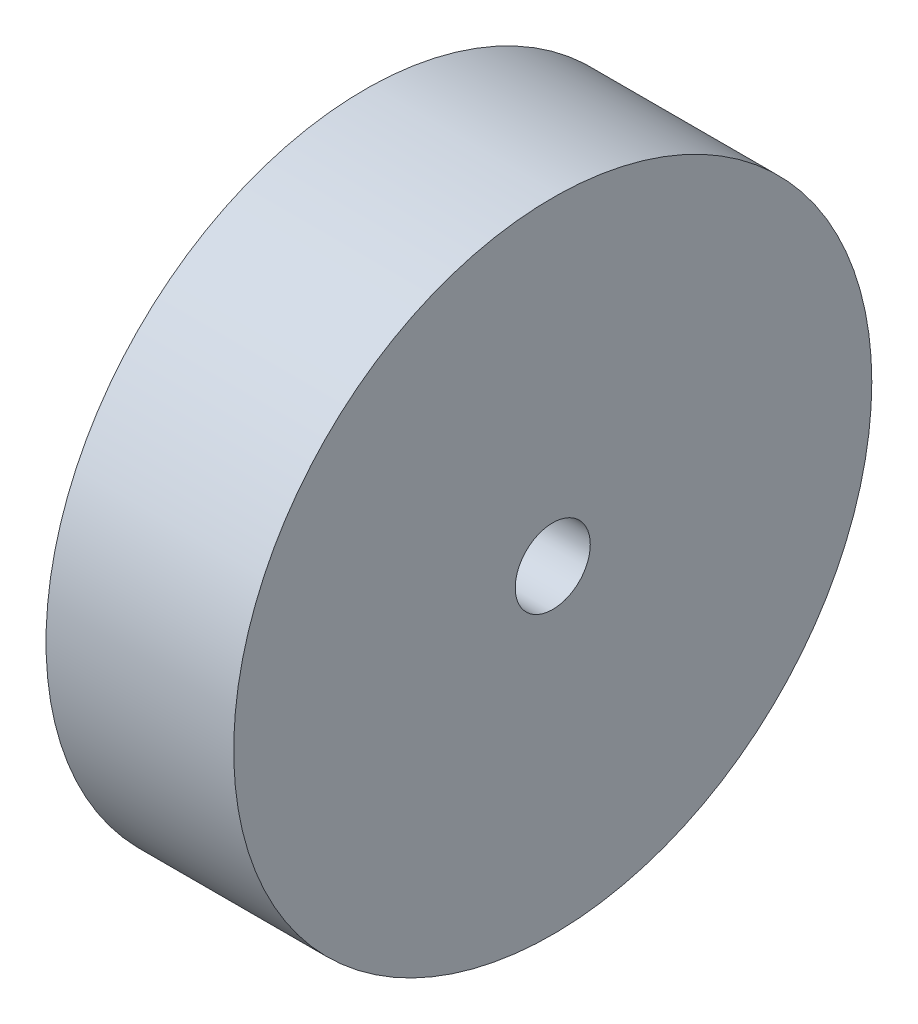
ISO-10303-21;
HEADER;
FILE_DESCRIPTION(('STEP AP214'),'2;1');
FILE_NAME('part.step','',(''),(''),'','','');
FILE_SCHEMA(('AUTOMOTIVE_DESIGN { 1 0 10303 214 1 1 1 1 }'));
ENDSEC;
DATA;
#1=APPLICATION_CONTEXT('core data for automotive mechanical design processes');
#2=APPLICATION_PROTOCOL_DEFINITION('international standard','automotive_design',2000,#1);
#3=PRODUCT_CONTEXT('',#1,'mechanical');
#4=PRODUCT('Part','Part','',(#3));
#5=PRODUCT_RELATED_PRODUCT_CATEGORY('part','',(#4));
#6=PRODUCT_DEFINITION_FORMATION('','',#4);
#7=PRODUCT_DEFINITION_CONTEXT('part definition',#1,'design');
#8=PRODUCT_DEFINITION('design','',#6,#7);
#9=PRODUCT_DEFINITION_SHAPE('','',#8);
#10=(LENGTH_UNIT() NAMED_UNIT(*) SI_UNIT(.MILLI.,.METRE.));
#11=(NAMED_UNIT(*) PLANE_ANGLE_UNIT() SI_UNIT($,.RADIAN.));
#12=(NAMED_UNIT(*) SI_UNIT($,.STERADIAN.) SOLID_ANGLE_UNIT());
#13=UNCERTAINTY_MEASURE_WITH_UNIT(LENGTH_MEASURE(1.E-05),#10,'distance_accuracy_value','');
#14=(GEOMETRIC_REPRESENTATION_CONTEXT(3) GLOBAL_UNCERTAINTY_ASSIGNED_CONTEXT((#13)) GLOBAL_UNIT_ASSIGNED_CONTEXT((#10,
#11,#12)) REPRESENTATION_CONTEXT('',''));
#15=CARTESIAN_POINT('',(0.,0.,0.));
#16=DIRECTION('',(0.,0.,1.));
#17=DIRECTION('',(1.,0.,0.));
#18=AXIS2_PLACEMENT_3D('',#15,#16,#17);
#19=CARTESIAN_POINT('',(0.,0.,0.));
#20=DIRECTION('',(1.,0.,0.));
#21=DIRECTION('',(0.,0.,-1.));
#22=AXIS2_PLACEMENT_3D('',#19,#20,#21);
#23=CYLINDRICAL_SURFACE('',#22,1.99999999999999);
#24=CARTESIAN_POINT('',(-6.,1.79843682124226,0.875));
#25=CARTESIAN_POINT('',(-6.04642538847907,1.79844267025873,0.874994185373086));
#26=CARTESIAN_POINT('',(-6.09291604796852,1.80026089575614,0.871281814553724));
#27=CARTESIAN_POINT('',(-6.18454082122053,1.80729814585878,0.856583265673776));
#28=CARTESIAN_POINT('',(-6.22967111551651,1.81252595391356,0.84557829993033));
#29=CARTESIAN_POINT('',(-6.31707746183327,1.8256650779135,0.816819377461344));
#30=CARTESIAN_POINT('',(-6.35936502724553,1.83356467551631,0.799094852047655));
#31=CARTESIAN_POINT('',(-6.44035556017453,1.85114060751144,0.757486974078158));
#32=CARTESIAN_POINT('',(-6.47905911969359,1.86081664768249,0.733604641137709));
#33=CARTESIAN_POINT('',(-6.55446563966568,1.88159814273405,0.678604442313139));
#34=CARTESIAN_POINT('',(-6.59089302069258,1.89275511820233,0.647128046535023));
#35=CARTESIAN_POINT('',(-6.65815821461785,1.91482009276173,0.578584404393027));
#36=CARTESIAN_POINT('',(-6.68899373976399,1.92572798836068,0.54151488106822));
#37=CARTESIAN_POINT('',(-6.74565743468384,1.94670307260467,0.460623507148395));
#38=CARTESIAN_POINT('',(-6.77116872176951,1.95670347428989,0.416560777930319));
#39=CARTESIAN_POINT('',(-6.81429557347723,1.97409759337226,0.324251594935385));
#40=CARTESIAN_POINT('',(-6.83191498455052,1.98149258025648,0.276007192994717));
#41=CARTESIAN_POINT('',(-6.8577379032294,1.99247601660861,0.179604041111904));
#42=CARTESIAN_POINT('',(-6.86641848062598,1.99625645567351,0.131595413599109));
#43=CARTESIAN_POINT('',(-6.87566581089588,2.00028676065695,0.0346643937267885));
#44=CARTESIAN_POINT('',(-6.87623621537626,2.00053821550072,-0.0142575774637103));
#45=CARTESIAN_POINT('',(-6.86948179784566,1.99759023252614,-0.108130873463998));
#46=CARTESIAN_POINT('',(-6.86268317041929,1.99462077737978,-0.153128695211825));
#47=CARTESIAN_POINT('',(-6.84229487504797,1.98588800112158,-0.241269408956309));
#48=CARTESIAN_POINT('',(-6.82870470457217,1.98012447326713,-0.284412163433234));
#49=CARTESIAN_POINT('',(-6.79496821887023,1.96624268291741,-0.368417631333128));
#50=CARTESIAN_POINT('',(-6.77472485613382,1.95808977061224,-0.409235407844305));
#51=CARTESIAN_POINT('',(-6.72835811361939,1.94021222057016,-0.487002053634944));
#52=CARTESIAN_POINT('',(-6.70223260185742,1.93048701331644,-0.523949512986163));
#53=CARTESIAN_POINT('',(-6.64252335619401,1.90954741359336,-0.595935871549109));
#54=CARTESIAN_POINT('',(-6.60852173184016,1.89827601276048,-0.63061203835614));
#55=CARTESIAN_POINT('',(-6.53518721195428,1.87605441136165,-0.693936886024363));
#56=CARTESIAN_POINT('',(-6.49585183471341,1.86510436321814,-0.722582745149669));
#57=CARTESIAN_POINT('',(-6.41102869970674,1.84433360774734,-0.774104007572309));
#58=CARTESIAN_POINT('',(-6.36535980910203,1.83457425910817,-0.796708133338993));
#59=CARTESIAN_POINT('',(-6.27032495122733,1.81804057215013,-0.833753424928246));
#60=CARTESIAN_POINT('',(-6.22096197595033,1.81126384804949,-0.848201117652946));
#61=CARTESIAN_POINT('',(-6.12358464961157,1.8020725724064,-0.86754954409033));
#62=CARTESIAN_POINT('',(-6.07571404837709,1.79938817756936,-0.873042695282303));
#63=CARTESIAN_POINT('',(-5.97966999827753,1.79791183626622,-0.876080687797387));
#64=CARTESIAN_POINT('',(-5.93149668154382,1.79911829529383,-0.873628785071821));
#65=CARTESIAN_POINT('',(-5.83996844280933,1.80500670942424,-0.86138817036423));
#66=CARTESIAN_POINT('',(-5.79652017859095,1.80942578993548,-0.85215387305427));
#67=CARTESIAN_POINT('',(-5.71183529542373,1.82089297578771,-0.827365600067959));
#68=CARTESIAN_POINT('',(-5.67059923296949,1.82794173912937,-0.811810042595479));
#69=CARTESIAN_POINT('',(-5.58946456457964,1.84425139082009,-0.774064553531829));
#70=CARTESIAN_POINT('',(-5.54970577491107,1.85359632906456,-0.751611624558049));
#71=CARTESIAN_POINT('',(-5.47431726076737,1.87333686493426,-0.700961597965225));
#72=CARTESIAN_POINT('',(-5.43868945497814,1.88373294661274,-0.672761847799738));
#73=CARTESIAN_POINT('',(-5.36917710610841,1.9055511022817,-0.608384071274638));
#74=CARTESIAN_POINT('',(-5.3357501990277,1.916980032671,-0.571712181701359));
#75=CARTESIAN_POINT('',(-5.2754278580816,1.93870750509733,-0.493028918701695));
#76=CARTESIAN_POINT('',(-5.24853322461174,1.94900590852695,-0.451016891911294));
#77=CARTESIAN_POINT('',(-5.20195768745987,1.96743104077039,-0.362322938836727));
#78=CARTESIAN_POINT('',(-5.1823277209333,1.97554233072843,-0.315610854101783));
#79=CARTESIAN_POINT('',(-5.15136282452992,1.98855746644758,-0.219097297225342));
#80=CARTESIAN_POINT('',(-5.14002239534112,1.99346343839954,-0.169297897056044));
#81=CARTESIAN_POINT('',(-5.12670151891969,1.99924812112771,-0.0720911804508378));
#82=CARTESIAN_POINT('',(-5.12407777220674,2.00040346809815,-0.024787979875931));
#83=CARTESIAN_POINT('',(-5.12649551071869,1.9993457538679,0.0695781809476576));
#84=CARTESIAN_POINT('',(-5.13153539477835,1.99713339628287,0.116641189318637));
#85=CARTESIAN_POINT('',(-5.14867690169036,1.98974125718853,0.207139588656078));
#86=CARTESIAN_POINT('',(-5.16047281000768,1.98469010746016,0.250644310304772));
#87=CARTESIAN_POINT('',(-5.1904404023771,1.9722009996307,0.335028608079218));
#88=CARTESIAN_POINT('',(-5.20861322951998,1.96476261362742,0.375907711996159));
#89=CARTESIAN_POINT('',(-5.25173867723915,1.94778329676525,0.4559504135109));
#90=CARTESIAN_POINT('',(-5.27696367107124,1.93816167830775,0.494949713940656));
#91=CARTESIAN_POINT('',(-5.33309714262607,1.9179284324557,0.568332496894423));
#92=CARTESIAN_POINT('',(-5.36400796125702,1.90731639818727,0.60271406813105));
#93=CARTESIAN_POINT('',(-5.4333978907796,1.8852720278619,0.668615771310959));
#94=CARTESIAN_POINT('',(-5.47227390119992,1.87383871323809,0.699719139890723));
#95=CARTESIAN_POINT('',(-5.55501578832401,1.85224037393765,0.755043607534098));
#96=CARTESIAN_POINT('',(-5.59888465764456,1.84207611764286,0.779260548271214));
#97=CARTESIAN_POINT('',(-5.69062059696355,1.82429849284975,0.820019671710733));
#98=CARTESIAN_POINT('',(-5.73849258074166,1.81668831862308,0.836552253811328));
#99=CARTESIAN_POINT('',(-5.83670036977745,1.80518424635639,0.861104681242927));
#100=CARTESIAN_POINT('',(-5.88702730845907,1.80127788482797,0.869153086488735));
#101=CARTESIAN_POINT('',(-5.95840239459506,1.79879556732175,0.87426080564379));
#102=CARTESIAN_POINT('',(-5.97919464294806,1.79843420002831,0.875002605802407));
#103=CARTESIAN_POINT('',(-6.,1.79843682124226,0.875));
#104=B_SPLINE_CURVE_WITH_KNOTS('',3,(#24,#25,#26,#27,#28,#29,#30,#31,#32,#33,#34,#35,#36,#37,
#38,#39,#40,#41,#42,#43,#44,#45,#46,#47,#48,#49,#50,#51,#52,#53,#54,#55,#56,#57,#58,#59,#60,#61,
#62,#63,#64,#65,#66,#67,#68,#69,#70,#71,#72,#73,#74,#75,#76,#77,#78,#79,#80,#81,#82,#83,#84,#85,
#86,#87,#88,#89,#90,#91,#92,#93,#94,#95,#96,#97,#98,#99,#100,#101,#102,#103),.UNSPECIFIED.,.T.,
.F.,(4,2,2,2,2,2,2,2,2,2,2,2,2,2,2,2,2,2,2,2,2,2,2,2,2,2,2,2,2,2,2,2,2,2,2,2,2,2,2,4),(0.,
0.139211854544829,0.278783757833574,0.417751277057174,0.556695800673242,0.704311269509712,
0.851986995525498,1.00685254156656,1.16164252475057,1.30765941027075,1.45361054957449,
1.58978716337857,1.72597385487562,1.86424242444374,2.00256119034027,2.1514705177321,
2.30044936949917,2.45528783220658,2.61000221454628,2.75399082716966,2.89792043948698,
3.03123544972419,3.16458384051276,3.30382998316913,3.44314054349794,3.5951953656407,
3.74726880958003,3.90038919363013,4.0534079045894,4.19484840308351,4.33625935442152,
4.47172667892147,4.60721829895103,4.74891487272682,4.8906699154392,5.04321071182055,
5.19584342435714,5.34866632230719,5.50097312018722,5.56336037066705),.UNSPECIFIED.);
#105=CARTESIAN_POINT('',(-6.,1.79843682124226,0.875));
#106=VERTEX_POINT('',#105);
#107=EDGE_CURVE('E69',#106,#106,#104,.T.);
#108=ORIENTED_EDGE('',*,*,#107,.F.);
#109=EDGE_LOOP('',(#108));
#110=FACE_BOUND('',#109,.T.);
#111=CARTESIAN_POINT('',(0.,0.,0.));
#112=DIRECTION('',(1.,0.,0.));
#113=DIRECTION('',(0.,0.,-1.));
#114=AXIS2_PLACEMENT_3D('',#111,#112,#113);
#115=CIRCLE('',#114,1.99999999999999);
#116=CARTESIAN_POINT('',(0.,0.,-1.99999999999999));
#117=VERTEX_POINT('',#116);
#118=EDGE_CURVE('E59',#117,#117,#115,.T.);
#119=ORIENTED_EDGE('',*,*,#118,.T.);
#120=EDGE_LOOP('',(#119));
#121=FACE_BOUND('',#120,.T.);
#122=CARTESIAN_POINT('',(-9.,0.,0.));
#123=DIRECTION('',(1.,0.,0.));
#124=DIRECTION('',(0.,0.,-1.));
#125=AXIS2_PLACEMENT_3D('',#122,#123,#124);
#126=CIRCLE('',#125,2.);
#127=CARTESIAN_POINT('',(-9.,0.,-2.));
#128=VERTEX_POINT('',#127);
#129=EDGE_CURVE('E10',#128,#128,#126,.T.);
#130=ORIENTED_EDGE('',*,*,#129,.F.);
#131=EDGE_LOOP('',(#130));
#132=FACE_BOUND('',#131,.T.);
#133=ADVANCED_FACE('F31',(#110,#121,#132),#23,.F.);
#134=CARTESIAN_POINT('',(-9.,5.,0.));
#135=DIRECTION('',(-1.,0.,0.));
#136=DIRECTION('',(0.,0.,1.));
#137=AXIS2_PLACEMENT_3D('',#134,#135,#136);
#138=PLANE('',#137);
#139=ORIENTED_EDGE('',*,*,#129,.T.);
#140=EDGE_LOOP('',(#139));
#141=FACE_BOUND('',#140,.T.);
#142=CARTESIAN_POINT('',(-9.,0.,0.));
#143=DIRECTION('',(1.,0.,0.));
#144=DIRECTION('',(0.,0.,-1.));
#145=AXIS2_PLACEMENT_3D('',#142,#143,#144);
#146=CIRCLE('',#145,5.);
#147=CARTESIAN_POINT('',(-9.,0.,-5.));
#148=VERTEX_POINT('',#147);
#149=EDGE_CURVE('E37',#148,#148,#146,.T.);
#150=ORIENTED_EDGE('',*,*,#149,.F.);
#151=EDGE_LOOP('',(#150));
#152=FACE_BOUND('',#151,.T.);
#153=ADVANCED_FACE('F104',(#141,#152),#138,.T.);
#154=CARTESIAN_POINT('',(0.,0.,0.));
#155=DIRECTION('',(1.,0.,0.));
#156=DIRECTION('',(0.,0.,-1.));
#157=AXIS2_PLACEMENT_3D('',#154,#155,#156);
#158=CYLINDRICAL_SURFACE('',#157,5.);
#159=CARTESIAN_POINT('',(-6.,4.9228421668788,0.874999999999999));
#160=CARTESIAN_POINT('',(-5.95125633370826,4.92284307499697,0.874998073539558));
#161=CARTESIAN_POINT('',(-5.90248695826357,4.92357397476884,0.870913147606657));
#162=CARTESIAN_POINT('',(-5.80631921136993,4.92641556128211,0.854689981459767));
#163=CARTESIAN_POINT('',(-5.75892210461289,4.92852748100301,0.842544544648483));
#164=CARTESIAN_POINT('',(-5.66690445339541,4.93388475646331,0.810581240433704));
#165=CARTESIAN_POINT('',(-5.62228152527276,4.93712912285695,0.790770068454977));
#166=CARTESIAN_POINT('',(-5.53699692169798,4.94438456334799,0.744054765254318));
#167=CARTESIAN_POINT('',(-5.49633485411407,4.94839556143087,0.717151337156948));
#168=CARTESIAN_POINT('',(-5.41968067245597,4.95678097185183,0.656703779310402));
#169=CARTESIAN_POINT('',(-5.38373779725447,4.96115853789756,0.623097637866166));
#170=CARTESIAN_POINT('',(-5.31797048004545,4.96975589120863,0.550332633939764));
#171=CARTESIAN_POINT('',(-5.28814641540476,4.97397566872952,0.511173429233959));
#172=CARTESIAN_POINT('',(-5.23527697640987,4.98181553132084,0.428093104045912));
#173=CARTESIAN_POINT('',(-5.21227766520037,4.98543147235489,0.384142246104394));
#174=CARTESIAN_POINT('',(-5.17400694114198,4.99162106697564,0.292926899802079));
#175=CARTESIAN_POINT('',(-5.15873497471276,4.99419479522293,0.245662649086158));
#176=CARTESIAN_POINT('',(-5.13650371136056,4.99798770637486,0.14967153315827));
#177=CARTESIAN_POINT('',(-5.12946156792315,4.9992203802933,0.100964396772045));
#178=CARTESIAN_POINT('',(-5.12363203262882,5.00023870350343,0.00304537017441713));
#179=CARTESIAN_POINT('',(-5.12484402482269,5.00002446076855,-0.0461664820998775));
#180=CARTESIAN_POINT('',(-5.13542416191989,4.99818371661764,-0.143130893939204));
#181=CARTESIAN_POINT('',(-5.14470313055934,4.99657265682183,-0.19089351907177));
#182=CARTESIAN_POINT('',(-5.17101316499013,4.99213654894816,-0.284173216176668));
#183=CARTESIAN_POINT('',(-5.18804448542923,4.9893114609923,-0.32969021433063));
#184=CARTESIAN_POINT('',(-5.2294629716464,4.98273861194286,-0.417449271832486));
#185=CARTESIAN_POINT('',(-5.25388645745274,4.9789863122702,-0.45967383590661));
#186=CARTESIAN_POINT('',(-5.30936931541862,4.9709751939494,-0.539458800879954));
#187=CARTESIAN_POINT('',(-5.34042927816796,4.96671633023635,-0.577018786200774));
#188=CARTESIAN_POINT('',(-5.40879680214816,4.9580977872857,-0.646935876894304));
#189=CARTESIAN_POINT('',(-5.44618233786575,4.95373752143685,-0.679216709920824));
#190=CARTESIAN_POINT('',(-5.5258782032965,4.9454624226339,-0.737060264743537));
#191=CARTESIAN_POINT('',(-5.56818858793485,4.9415475946486,-0.76262291160371));
#192=CARTESIAN_POINT('',(-5.65662644788704,4.93460609657369,-0.806322044336456));
#193=CARTESIAN_POINT('',(-5.7027589215931,4.93158061381118,-0.824448615268407));
#194=CARTESIAN_POINT('',(-5.79747898147369,4.92677939981509,-0.85267327850563));
#195=CARTESIAN_POINT('',(-5.846066327286,4.92500354648059,-0.862772155207126));
#196=CARTESIAN_POINT('',(-5.94363241488622,4.92292649963477,-0.874545835364774));
#197=CARTESIAN_POINT('',(-5.99259760272956,4.92260621694777,-0.876329694679996));
#198=CARTESIAN_POINT('',(-6.09012659687243,4.92342563856456,-0.871713985213454));
#199=CARTESIAN_POINT('',(-6.13869042025111,4.92456528041931,-0.865314766467179));
#200=CARTESIAN_POINT('',(-6.23368705452265,4.92815844955311,-0.844607784274871));
#201=CARTESIAN_POINT('',(-6.28013248922682,4.93060264449508,-0.830356171120177));
#202=CARTESIAN_POINT('',(-6.36997599936905,4.93652160979565,-0.794408105046442));
#203=CARTESIAN_POINT('',(-6.413373875668,4.93999644742304,-0.772711166165631));
#204=CARTESIAN_POINT('',(-6.49637382659239,4.94762918558854,-0.722233434260734));
#205=CARTESIAN_POINT('',(-6.53593301791774,4.95179364615566,-0.693383138862325));
#206=CARTESIAN_POINT('',(-6.60968795542974,4.96031750209385,-0.629512391964064));
#207=CARTESIAN_POINT('',(-6.64388328366827,4.9646769126213,-0.594491460103898));
#208=CARTESIAN_POINT('',(-6.70634159501341,4.97316022831522,-0.518788866666415));
#209=CARTESIAN_POINT('',(-6.73453160914478,4.97728083740703,-0.478046575925642));
#210=CARTESIAN_POINT('',(-6.78366648300501,4.98476842205262,-0.392341011884006));
#211=CARTESIAN_POINT('',(-6.80461159513372,4.98813542385933,-0.347377885699142));
#212=CARTESIAN_POINT('',(-6.83855021909131,4.99372215663664,-0.254717878442438));
#213=CARTESIAN_POINT('',(-6.85158100293304,4.99594725750524,-0.207034986784644));
#214=CARTESIAN_POINT('',(-6.86944070600445,4.99902226336019,-0.110115257508315));
#215=CARTESIAN_POINT('',(-6.87427037242224,4.99987229362628,-0.0608785618702622));
#216=CARTESIAN_POINT('',(-6.8755674939417,5.00009933383322,0.0370486139692485));
#217=CARTESIAN_POINT('',(-6.87214565193164,4.99949584443935,0.0857376177642943));
#218=CARTESIAN_POINT('',(-6.85727749914738,4.99692373636934,0.181835857215837));
#219=CARTESIAN_POINT('',(-6.8458312449788,4.99495512732298,0.229245101897531));
#220=CARTESIAN_POINT('',(-6.81528331342961,4.98987344263051,0.321389465944215));
#221=CARTESIAN_POINT('',(-6.79619197230702,4.98676191269648,0.366128102540404));
#222=CARTESIAN_POINT('',(-6.75090846791264,4.97973294623664,0.451784012491349));
#223=CARTESIAN_POINT('',(-6.7247159130648,4.97581546527185,0.49270107494903));
#224=CARTESIAN_POINT('',(-6.66558540578185,4.96754602270754,0.570107756976133));
#225=CARTESIAN_POINT('',(-6.63256679239834,4.96318921812377,0.606535249660263));
#226=CARTESIAN_POINT('',(-6.56089009426109,4.95456452663817,0.67337125463544));
#227=CARTESIAN_POINT('',(-6.5222306895416,4.95029666081621,0.703778354196429));
#228=CARTESIAN_POINT('',(-6.44000615661261,4.94229651148942,0.757933111841927));
#229=CARTESIAN_POINT('',(-6.39640470900435,4.93856872220172,0.781626301002854));
#230=CARTESIAN_POINT('',(-6.30579156568533,4.93212424297686,0.821314870424467));
#231=CARTESIAN_POINT('',(-6.25878325678003,4.92940656491337,0.837317778102986));
#232=CARTESIAN_POINT('',(-6.17634026690134,4.92587891597868,0.857781628925297));
#233=CARTESIAN_POINT('',(-6.14139873101838,4.92474663101162,0.86422789020777));
#234=CARTESIAN_POINT('',(-6.07097599994486,4.92322793379499,0.872837731365282));
#235=CARTESIAN_POINT('',(-6.03549481631258,4.92284150559315,0.875001402835788));
#236=CARTESIAN_POINT('',(-6.,4.9228421668788,0.874999999999999));
#237=B_SPLINE_CURVE_WITH_KNOTS('',3,(#159,#160,#161,#162,#163,#164,#165,#166,#167,#168,#169,
#170,#171,#172,#173,#174,#175,#176,#177,#178,#179,#180,#181,#182,#183,#184,#185,#186,#187,#188,
#189,#190,#191,#192,#193,#194,#195,#196,#197,#198,#199,#200,#201,#202,#203,#204,#205,#206,#207,
#208,#209,#210,#211,#212,#213,#214,#215,#216,#217,#218,#219,#220,#221,#222,#223,#224,#225,#226,
#227,#228,#229,#230,#231,#232,#233,#234,#235,#236),.UNSPECIFIED.,.T.,.F.,(4,2,2,2,2,2,2,2,2,2,2,
2,2,2,2,2,2,2,2,2,2,2,2,2,2,2,2,2,2,2,2,2,2,2,2,2,2,2,4),(0.,0.146101164953182,
0.292332947963996,0.438437296117105,0.584527164964142,0.732037167460387,0.879556264642582,
1.02804949490523,1.17653208573414,1.32350671966023,1.47047038600328,1.61582980987729,
1.76119400883468,1.90728435279679,2.05338770297162,2.20144435454404,2.34950265750048,
2.49775773829612,2.64599833111777,2.79228909464301,2.93857360071283,3.08382539293052,
3.22908666764115,3.37581877017581,3.5225623002909,3.67099828718693,3.81942910230912,
3.96715535955238,4.1148681570168,4.26061027818324,4.40635137126932,4.55189608218353,
4.69744882037613,4.84483139209219,4.99224850734336,5.14082942553665,5.28926461170159,
5.39565679196016,5.50204669669218),.UNSPECIFIED.);
#238=CARTESIAN_POINT('',(-6.,4.9228421668788,0.874999999999999));
#239=VERTEX_POINT('',#238);
#240=EDGE_CURVE('E62',#239,#239,#237,.T.);
#241=ORIENTED_EDGE('',*,*,#240,.F.);
#242=EDGE_LOOP('',(#241));
#243=FACE_BOUND('',#242,.T.);
#244=ORIENTED_EDGE('',*,*,#149,.T.);
#245=EDGE_LOOP('',(#244));
#246=FACE_BOUND('',#245,.T.);
#247=CARTESIAN_POINT('',(-3.,0.,0.));
#248=DIRECTION('',(1.,0.,0.));
#249=DIRECTION('',(0.,0.,-1.));
#250=AXIS2_PLACEMENT_3D('',#247,#248,#249);
#251=CIRCLE('',#250,5.);
#252=CARTESIAN_POINT('',(-3.,0.,-5.));
#253=VERTEX_POINT('',#252);
#254=EDGE_CURVE('E41',#253,#253,#251,.T.);
#255=ORIENTED_EDGE('',*,*,#254,.F.);
#256=EDGE_LOOP('',(#255));
#257=FACE_BOUND('',#256,.T.);
#258=ADVANCED_FACE('F73',(#243,#246,#257),#158,.T.);
#259=CARTESIAN_POINT('',(-3.,13.,0.));
#260=DIRECTION('',(-1.,0.,0.));
#261=DIRECTION('',(0.,0.,1.));
#262=AXIS2_PLACEMENT_3D('',#259,#260,#261);
#263=PLANE('',#262);
#264=ORIENTED_EDGE('',*,*,#254,.T.);
#265=EDGE_LOOP('',(#264));
#266=FACE_BOUND('',#265,.T.);
#267=CARTESIAN_POINT('',(-3.,0.,0.));
#268=DIRECTION('',(1.,0.,0.));
#269=DIRECTION('',(0.,0.,-1.));
#270=AXIS2_PLACEMENT_3D('',#267,#268,#269);
#271=CIRCLE('',#270,13.);
#272=CARTESIAN_POINT('',(-3.,0.,-13.));
#273=VERTEX_POINT('',#272);
#274=EDGE_CURVE('E45',#273,#273,#271,.T.);
#275=ORIENTED_EDGE('',*,*,#274,.F.);
#276=EDGE_LOOP('',(#275));
#277=FACE_BOUND('',#276,.T.);
#278=ADVANCED_FACE('F97',(#266,#277),#263,.T.);
#279=CARTESIAN_POINT('',(0.,0.,0.));
#280=DIRECTION('',(1.,0.,0.));
#281=DIRECTION('',(0.,0.,-1.));
#282=AXIS2_PLACEMENT_3D('',#279,#280,#281);
#283=CYLINDRICAL_SURFACE('',#282,13.);
#284=ORIENTED_EDGE('',*,*,#274,.T.);
#285=EDGE_LOOP('',(#284));
#286=FACE_BOUND('',#285,.T.);
#287=CARTESIAN_POINT('',(-10.,0.,0.));
#288=DIRECTION('',(1.,0.,0.));
#289=DIRECTION('',(0.,0.,-1.));
#290=AXIS2_PLACEMENT_3D('',#287,#288,#289);
#291=CIRCLE('',#290,13.);
#292=CARTESIAN_POINT('',(-10.,0.,-13.));
#293=VERTEX_POINT('',#292);
#294=EDGE_CURVE('E50',#293,#293,#291,.T.);
#295=ORIENTED_EDGE('',*,*,#294,.F.);
#296=EDGE_LOOP('',(#295));
#297=FACE_BOUND('',#296,.T.);
#298=ADVANCED_FACE('F94',(#286,#297),#283,.F.);
#299=CARTESIAN_POINT('',(-10.,13.,0.));
#300=DIRECTION('',(-1.,0.,0.));
#301=DIRECTION('',(0.,0.,1.));
#302=AXIS2_PLACEMENT_3D('',#299,#300,#301);
#303=PLANE('',#302);
#304=ORIENTED_EDGE('',*,*,#294,.T.);
#305=EDGE_LOOP('',(#304));
#306=FACE_BOUND('',#305,.T.);
#307=CARTESIAN_POINT('',(-10.,0.,0.));
#308=DIRECTION('',(1.,0.,0.));
#309=DIRECTION('',(0.,0.,-1.));
#310=AXIS2_PLACEMENT_3D('',#307,#308,#309);
#311=CIRCLE('',#310,17.);
#312=CARTESIAN_POINT('',(-10.,0.,-17.));
#313=VERTEX_POINT('',#312);
#314=EDGE_CURVE('E53',#313,#313,#311,.T.);
#315=ORIENTED_EDGE('',*,*,#314,.F.);
#316=EDGE_LOOP('',(#315));
#317=FACE_BOUND('',#316,.T.);
#318=ADVANCED_FACE('F90',(#306,#317),#303,.T.);
#319=CARTESIAN_POINT('',(0.,0.,0.));
#320=DIRECTION('',(1.,0.,0.));
#321=DIRECTION('',(0.,0.,-1.));
#322=AXIS2_PLACEMENT_3D('',#319,#320,#321);
#323=CYLINDRICAL_SURFACE('',#322,17.);
#324=ORIENTED_EDGE('',*,*,#314,.T.);
#325=EDGE_LOOP('',(#324));
#326=FACE_BOUND('',#325,.T.);
#327=CARTESIAN_POINT('',(0.,0.,0.));
#328=DIRECTION('',(1.,0.,0.));
#329=DIRECTION('',(0.,0.,-1.));
#330=AXIS2_PLACEMENT_3D('',#327,#328,#329);
#331=CIRCLE('',#330,17.);
#332=CARTESIAN_POINT('',(0.,0.,-17.));
#333=VERTEX_POINT('',#332);
#334=EDGE_CURVE('E56',#333,#333,#331,.T.);
#335=ORIENTED_EDGE('',*,*,#334,.F.);
#336=EDGE_LOOP('',(#335));
#337=FACE_BOUND('',#336,.T.);
#338=ADVANCED_FACE('F86',(#326,#337),#323,.T.);
#339=CARTESIAN_POINT('',(0.,17.,0.));
#340=DIRECTION('',(1.,0.,0.));
#341=DIRECTION('',(0.,0.,-1.));
#342=AXIS2_PLACEMENT_3D('',#339,#340,#341);
#343=PLANE('',#342);
#344=ORIENTED_EDGE('',*,*,#334,.T.);
#345=EDGE_LOOP('',(#344));
#346=FACE_BOUND('',#345,.T.);
#347=ORIENTED_EDGE('',*,*,#118,.F.);
#348=EDGE_LOOP('',(#347));
#349=FACE_BOUND('',#348,.T.);
#350=ADVANCED_FACE('F79',(#346,#349),#343,.T.);
#351=CARTESIAN_POINT('',(-6.,5.,0.));
#352=DIRECTION('',(0.,1.,0.));
#353=DIRECTION('',(0.,0.,1.));
#354=AXIS2_PLACEMENT_3D('',#351,#352,#353);
#355=CYLINDRICAL_SURFACE('',#354,0.874999999999999);
#356=ORIENTED_EDGE('',*,*,#240,.T.);
#357=EDGE_LOOP('',(#356));
#358=FACE_BOUND('',#357,.T.);
#359=ORIENTED_EDGE('',*,*,#107,.T.);
#360=EDGE_LOOP('',(#359));
#361=FACE_BOUND('',#360,.T.);
#362=ADVANCED_FACE('F76',(#358,#361),#355,.F.);
#363=CLOSED_SHELL('',(#133,#153,#258,#278,#298,#318,#338,#350,#362));
#364=MANIFOLD_SOLID_BREP('B2',#363);
#365=ADVANCED_BREP_SHAPE_REPRESENTATION('',(#18,#364),#14);
#366=SHAPE_DEFINITION_REPRESENTATION(#9,#365);
ENDSEC;
END-ISO-10303-21;
